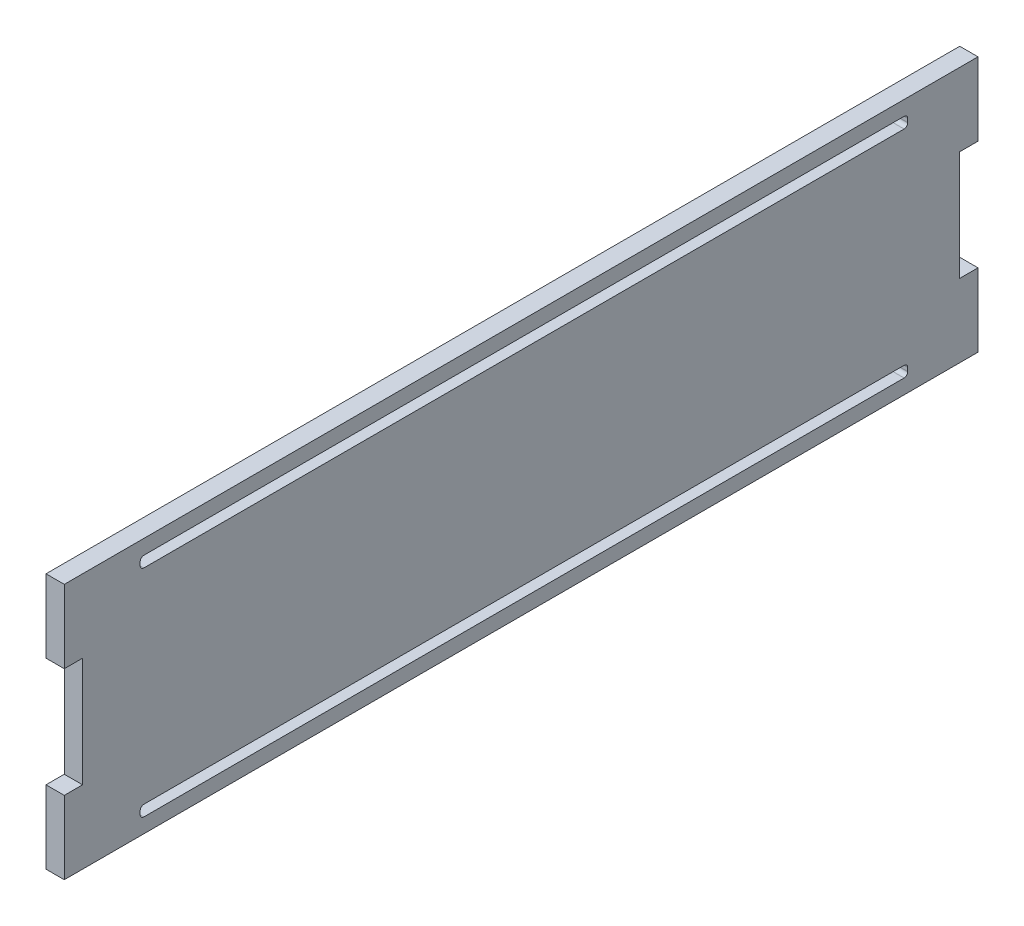
ISO-10303-21;
HEADER;
FILE_DESCRIPTION(('STEP AP214'),'2;1');
FILE_NAME('part.step','',(''),(''),'','','');
FILE_SCHEMA(('AUTOMOTIVE_DESIGN { 1 0 10303 214 1 1 1 1 }'));
ENDSEC;
DATA;
#1=APPLICATION_CONTEXT('core data for automotive mechanical design processes');
#2=APPLICATION_PROTOCOL_DEFINITION('international standard','automotive_design',2000,#1);
#3=PRODUCT_CONTEXT('',#1,'mechanical');
#4=PRODUCT('Part','Part','',(#3));
#5=PRODUCT_RELATED_PRODUCT_CATEGORY('part','',(#4));
#6=PRODUCT_DEFINITION_FORMATION('','',#4);
#7=PRODUCT_DEFINITION_CONTEXT('part definition',#1,'design');
#8=PRODUCT_DEFINITION('design','',#6,#7);
#9=PRODUCT_DEFINITION_SHAPE('','',#8);
#10=(LENGTH_UNIT() NAMED_UNIT(*) SI_UNIT(.MILLI.,.METRE.));
#11=(NAMED_UNIT(*) PLANE_ANGLE_UNIT() SI_UNIT($,.RADIAN.));
#12=(NAMED_UNIT(*) SI_UNIT($,.STERADIAN.) SOLID_ANGLE_UNIT());
#13=UNCERTAINTY_MEASURE_WITH_UNIT(LENGTH_MEASURE(1.E-05),#10,'distance_accuracy_value','');
#14=(GEOMETRIC_REPRESENTATION_CONTEXT(3) GLOBAL_UNCERTAINTY_ASSIGNED_CONTEXT((#13)) GLOBAL_UNIT_ASSIGNED_CONTEXT((#10,
#11,#12)) REPRESENTATION_CONTEXT('',''));
#15=CARTESIAN_POINT('',(0.,0.,0.));
#16=DIRECTION('',(0.,0.,1.));
#17=DIRECTION('',(1.,0.,0.));
#18=AXIS2_PLACEMENT_3D('',#15,#16,#17);
#19=CARTESIAN_POINT('',(5.,0.,0.));
#20=DIRECTION('',(1.,0.,0.));
#21=DIRECTION('',(0.,0.,-1.));
#22=AXIS2_PLACEMENT_3D('',#19,#20,#21);
#23=PLANE('',#22);
#24=DIRECTION('',(0.,1.,0.));
#25=VECTOR('',#24,1.);
#26=CARTESIAN_POINT('',(5.,0.,0.));
#27=LINE('',#26,#25);
#28=CARTESIAN_POINT('',(5.,0.,0.));
#29=VERTEX_POINT('',#28);
#30=CARTESIAN_POINT('',(5.,20.,0.));
#31=VERTEX_POINT('',#30);
#32=EDGE_CURVE('E344',#29,#31,#27,.T.);
#33=ORIENTED_EDGE('',*,*,#32,.T.);
#34=DIRECTION('',(0.,0.,1.));
#35=VECTOR('',#34,1.);
#36=CARTESIAN_POINT('',(5.,20.,0.));
#37=LINE('',#36,#35);
#38=CARTESIAN_POINT('',(5.,20.,5.));
#39=VERTEX_POINT('',#38);
#40=EDGE_CURVE('E347',#31,#39,#37,.T.);
#41=ORIENTED_EDGE('',*,*,#40,.T.);
#42=DIRECTION('',(0.,1.,0.));
#43=VECTOR('',#42,1.);
#44=CARTESIAN_POINT('',(5.,50.,5.00000000000001));
#45=LINE('',#44,#43);
#46=CARTESIAN_POINT('',(5.,50.,5.00000000000001));
#47=VERTEX_POINT('',#46);
#48=EDGE_CURVE('E350',#39,#47,#45,.T.);
#49=ORIENTED_EDGE('',*,*,#48,.T.);
#50=DIRECTION('',(0.,0.,-1.));
#51=VECTOR('',#50,1.);
#52=CARTESIAN_POINT('',(5.,50.,5.00000000000001));
#53=LINE('',#52,#51);
#54=CARTESIAN_POINT('',(5.,50.,0.));
#55=VERTEX_POINT('',#54);
#56=EDGE_CURVE('E352',#47,#55,#53,.T.);
#57=ORIENTED_EDGE('',*,*,#56,.T.);
#58=DIRECTION('',(0.,1.,0.));
#59=VECTOR('',#58,1.);
#60=CARTESIAN_POINT('',(5.,50.,0.));
#61=LINE('',#60,#59);
#62=CARTESIAN_POINT('',(5.,70.,0.));
#63=VERTEX_POINT('',#62);
#64=EDGE_CURVE('E354',#55,#63,#61,.T.);
#65=ORIENTED_EDGE('',*,*,#64,.T.);
#66=DIRECTION('',(0.,0.,1.));
#67=VECTOR('',#66,1.);
#68=CARTESIAN_POINT('',(5.,70.,0.));
#69=LINE('',#68,#67);
#70=CARTESIAN_POINT('',(5.,70.,250.));
#71=VERTEX_POINT('',#70);
#72=EDGE_CURVE('E356',#63,#71,#69,.T.);
#73=ORIENTED_EDGE('',*,*,#72,.T.);
#74=DIRECTION('',(0.,-1.,0.));
#75=VECTOR('',#74,1.);
#76=CARTESIAN_POINT('',(5.,50.,250.));
#77=LINE('',#76,#75);
#78=CARTESIAN_POINT('',(5.,50.,250.));
#79=VERTEX_POINT('',#78);
#80=EDGE_CURVE('E358',#71,#79,#77,.T.);
#81=ORIENTED_EDGE('',*,*,#80,.T.);
#82=DIRECTION('',(0.,0.,-1.));
#83=VECTOR('',#82,1.);
#84=CARTESIAN_POINT('',(5.,50.,245.));
#85=LINE('',#84,#83);
#86=CARTESIAN_POINT('',(5.,50.,245.));
#87=VERTEX_POINT('',#86);
#88=EDGE_CURVE('E360',#79,#87,#85,.T.);
#89=ORIENTED_EDGE('',*,*,#88,.T.);
#90=DIRECTION('',(0.,-1.,0.));
#91=VECTOR('',#90,1.);
#92=CARTESIAN_POINT('',(5.,50.,245.));
#93=LINE('',#92,#91);
#94=CARTESIAN_POINT('',(5.,20.,245.));
#95=VERTEX_POINT('',#94);
#96=EDGE_CURVE('E362',#87,#95,#93,.T.);
#97=ORIENTED_EDGE('',*,*,#96,.T.);
#98=DIRECTION('',(0.,0.,1.));
#99=VECTOR('',#98,1.);
#100=CARTESIAN_POINT('',(5.,20.,250.));
#101=LINE('',#100,#99);
#102=CARTESIAN_POINT('',(5.,20.,250.));
#103=VERTEX_POINT('',#102);
#104=EDGE_CURVE('E364',#95,#103,#101,.T.);
#105=ORIENTED_EDGE('',*,*,#104,.T.);
#106=DIRECTION('',(0.,-1.,0.));
#107=VECTOR('',#106,1.);
#108=CARTESIAN_POINT('',(5.,0.,250.));
#109=LINE('',#108,#107);
#110=CARTESIAN_POINT('',(5.,0.,250.));
#111=VERTEX_POINT('',#110);
#112=EDGE_CURVE('E366',#103,#111,#109,.T.);
#113=ORIENTED_EDGE('',*,*,#112,.T.);
#114=DIRECTION('',(0.,0.,-1.));
#115=VECTOR('',#114,1.);
#116=CARTESIAN_POINT('',(5.,0.,0.));
#117=LINE('',#116,#115);
#118=EDGE_CURVE('E368',#111,#29,#117,.T.);
#119=ORIENTED_EDGE('',*,*,#118,.T.);
#120=EDGE_LOOP('',(#33,#41,#49,#57,#65,#73,#81,#89,#97,#105,#113,#119));
#121=FACE_BOUND('',#120,.T.);
#122=DIRECTION('',(0.,1.,0.));
#123=VECTOR('',#122,1.);
#124=CARTESIAN_POINT('',(5.,65.,19.2219096004728));
#125=LINE('',#124,#123);
#126=CARTESIAN_POINT('',(5.,64.,19.2219096004728));
#127=VERTEX_POINT('',#126);
#128=CARTESIAN_POINT('',(5.,65.,19.2219096004728));
#129=VERTEX_POINT('',#128);
#130=EDGE_CURVE('E287',#127,#129,#125,.T.);
#131=ORIENTED_EDGE('',*,*,#130,.F.);
#132=CARTESIAN_POINT('',(5.,64.,20.2219096004728));
#133=DIRECTION('',(1.,0.,0.));
#134=DIRECTION('',(0.,0.,-1.));
#135=AXIS2_PLACEMENT_3D('',#132,#133,#134);
#136=CIRCLE('',#135,0.999999999999994);
#137=CARTESIAN_POINT('',(5.,63.,20.2219096004728));
#138=VERTEX_POINT('',#137);
#139=EDGE_CURVE('E285',#138,#127,#136,.T.);
#140=ORIENTED_EDGE('',*,*,#139,.F.);
#141=DIRECTION('',(0.,0.,-1.));
#142=VECTOR('',#141,1.);
#143=CARTESIAN_POINT('',(5.,63.,228.221909600473));
#144=LINE('',#143,#142);
#145=CARTESIAN_POINT('',(5.,63.,228.221909600473));
#146=VERTEX_POINT('',#145);
#147=EDGE_CURVE('E301',#146,#138,#144,.T.);
#148=ORIENTED_EDGE('',*,*,#147,.F.);
#149=CARTESIAN_POINT('',(5.,64.,228.221909600473));
#150=DIRECTION('',(1.,0.,0.));
#151=DIRECTION('',(0.,0.,-1.));
#152=AXIS2_PLACEMENT_3D('',#149,#150,#151);
#153=CIRCLE('',#152,1.00000000000001);
#154=CARTESIAN_POINT('',(5.,64.,229.221909600473));
#155=VERTEX_POINT('',#154);
#156=EDGE_CURVE('E298',#155,#146,#153,.T.);
#157=ORIENTED_EDGE('',*,*,#156,.F.);
#158=DIRECTION('',(0.,-1.,0.));
#159=VECTOR('',#158,1.);
#160=CARTESIAN_POINT('',(5.,65.,229.221909600473));
#161=LINE('',#160,#159);
#162=CARTESIAN_POINT('',(5.,65.,229.221909600473));
#163=VERTEX_POINT('',#162);
#164=EDGE_CURVE('E296',#163,#155,#161,.T.);
#165=ORIENTED_EDGE('',*,*,#164,.F.);
#166=CARTESIAN_POINT('',(5.,65.,228.221909600473));
#167=DIRECTION('',(1.,0.,0.));
#168=DIRECTION('',(0.,0.,-1.));
#169=AXIS2_PLACEMENT_3D('',#166,#167,#168);
#170=CIRCLE('',#169,1.00000000000001);
#171=CARTESIAN_POINT('',(5.,66.,228.221909600473));
#172=VERTEX_POINT('',#171);
#173=EDGE_CURVE('E294',#172,#163,#170,.T.);
#174=ORIENTED_EDGE('',*,*,#173,.F.);
#175=DIRECTION('',(0.,0.,1.));
#176=VECTOR('',#175,1.);
#177=CARTESIAN_POINT('',(5.,66.,228.221909600473));
#178=LINE('',#177,#176);
#179=CARTESIAN_POINT('',(5.,66.,20.2219096004728));
#180=VERTEX_POINT('',#179);
#181=EDGE_CURVE('E292',#180,#172,#178,.T.);
#182=ORIENTED_EDGE('',*,*,#181,.F.);
#183=CARTESIAN_POINT('',(5.,65.,20.2219096004728));
#184=DIRECTION('',(1.,0.,0.));
#185=DIRECTION('',(0.,0.,1.));
#186=AXIS2_PLACEMENT_3D('',#183,#184,#185);
#187=CIRCLE('',#186,0.999999999999994);
#188=EDGE_CURVE('E290',#129,#180,#187,.T.);
#189=ORIENTED_EDGE('',*,*,#188,.F.);
#190=EDGE_LOOP('',(#131,#140,#148,#157,#165,#174,#182,#189));
#191=FACE_BOUND('',#190,.T.);
#192=DIRECTION('',(0.,1.,0.));
#193=VECTOR('',#192,1.);
#194=CARTESIAN_POINT('',(5.,4.99999999999998,19.2219096004727));
#195=LINE('',#194,#193);
#196=CARTESIAN_POINT('',(5.,4.99999999999998,19.2219096004727));
#197=VERTEX_POINT('',#196);
#198=CARTESIAN_POINT('',(5.,5.99999999999998,19.2219096004727));
#199=VERTEX_POINT('',#198);
#200=EDGE_CURVE('E228',#197,#199,#195,.T.);
#201=ORIENTED_EDGE('',*,*,#200,.F.);
#202=CARTESIAN_POINT('',(5.,4.99999999999998,20.2219096004727));
#203=DIRECTION('',(1.,0.,0.));
#204=DIRECTION('',(0.,0.,-1.));
#205=AXIS2_PLACEMENT_3D('',#202,#203,#204);
#206=CIRCLE('',#205,0.999999999999994);
#207=CARTESIAN_POINT('',(5.,3.99999999999998,20.2219096004727));
#208=VERTEX_POINT('',#207);
#209=EDGE_CURVE('E220',#208,#197,#206,.T.);
#210=ORIENTED_EDGE('',*,*,#209,.F.);
#211=DIRECTION('',(0.,0.,-1.));
#212=VECTOR('',#211,1.);
#213=CARTESIAN_POINT('',(5.,3.99999999999998,228.221909600473));
#214=LINE('',#213,#212);
#215=CARTESIAN_POINT('',(5.,3.99999999999998,228.221909600473));
#216=VERTEX_POINT('',#215);
#217=EDGE_CURVE('E253',#216,#208,#214,.T.);
#218=ORIENTED_EDGE('',*,*,#217,.F.);
#219=CARTESIAN_POINT('',(5.,4.99999999999998,228.221909600473));
#220=DIRECTION('',(1.,0.,0.));
#221=DIRECTION('',(0.,0.,1.));
#222=AXIS2_PLACEMENT_3D('',#219,#220,#221);
#223=CIRCLE('',#222,1.);
#224=CARTESIAN_POINT('',(5.,4.99999999999998,229.221909600473));
#225=VERTEX_POINT('',#224);
#226=EDGE_CURVE('E251',#225,#216,#223,.T.);
#227=ORIENTED_EDGE('',*,*,#226,.F.);
#228=DIRECTION('',(0.,-1.,0.));
#229=VECTOR('',#228,1.);
#230=CARTESIAN_POINT('',(5.,4.99999999999998,229.221909600473));
#231=LINE('',#230,#229);
#232=CARTESIAN_POINT('',(5.,5.99999999999998,229.221909600473));
#233=VERTEX_POINT('',#232);
#234=EDGE_CURVE('E249',#233,#225,#231,.T.);
#235=ORIENTED_EDGE('',*,*,#234,.F.);
#236=CARTESIAN_POINT('',(5.,5.99999999999998,228.221909600473));
#237=DIRECTION('',(1.,0.,0.));
#238=DIRECTION('',(0.,0.,1.));
#239=AXIS2_PLACEMENT_3D('',#236,#237,#238);
#240=CIRCLE('',#239,1.);
#241=CARTESIAN_POINT('',(5.,6.99999999999998,228.221909600473));
#242=VERTEX_POINT('',#241);
#243=EDGE_CURVE('E247',#242,#233,#240,.T.);
#244=ORIENTED_EDGE('',*,*,#243,.F.);
#245=DIRECTION('',(0.,0.,1.));
#246=VECTOR('',#245,1.);
#247=CARTESIAN_POINT('',(5.,6.99999999999998,228.221909600473));
#248=LINE('',#247,#246);
#249=CARTESIAN_POINT('',(5.,6.99999999999998,20.2219096004727));
#250=VERTEX_POINT('',#249);
#251=EDGE_CURVE('E243',#250,#242,#248,.T.);
#252=ORIENTED_EDGE('',*,*,#251,.F.);
#253=CARTESIAN_POINT('',(5.,5.99999999999998,20.2219096004727));
#254=DIRECTION('',(1.,0.,0.));
#255=DIRECTION('',(0.,0.,1.));
#256=AXIS2_PLACEMENT_3D('',#253,#254,#255);
#257=CIRCLE('',#256,0.999999999999994);
#258=EDGE_CURVE('E241',#199,#250,#257,.T.);
#259=ORIENTED_EDGE('',*,*,#258,.F.);
#260=EDGE_LOOP('',(#201,#210,#218,#227,#235,#244,#252,#259));
#261=FACE_BOUND('',#260,.T.);
#262=ADVANCED_FACE('F35',(#121,#191,#261),#23,.T.);
#263=CARTESIAN_POINT('',(0.,0.,0.));
#264=DIRECTION('',(1.,0.,0.));
#265=DIRECTION('',(0.,0.,-1.));
#266=AXIS2_PLACEMENT_3D('',#263,#264,#265);
#267=PLANE('',#266);
#268=CARTESIAN_POINT('',(0.,64.,20.2219096004728));
#269=DIRECTION('',(1.,0.,0.));
#270=DIRECTION('',(0.,0.,-1.));
#271=AXIS2_PLACEMENT_3D('',#268,#269,#270);
#272=CIRCLE('',#271,0.999999999999994);
#273=CARTESIAN_POINT('',(0.,63.,20.2219096004728));
#274=VERTEX_POINT('',#273);
#275=CARTESIAN_POINT('',(0.,64.,19.2219096004728));
#276=VERTEX_POINT('',#275);
#277=EDGE_CURVE('E236',#274,#276,#272,.T.);
#278=ORIENTED_EDGE('',*,*,#277,.T.);
#279=DIRECTION('',(0.,1.,0.));
#280=VECTOR('',#279,1.);
#281=CARTESIAN_POINT('',(0.,65.,19.2219096004728));
#282=LINE('',#281,#280);
#283=CARTESIAN_POINT('',(0.,65.,19.2219096004728));
#284=VERTEX_POINT('',#283);
#285=EDGE_CURVE('E306',#276,#284,#282,.T.);
#286=ORIENTED_EDGE('',*,*,#285,.T.);
#287=CARTESIAN_POINT('',(0.,65.,20.2219096004728));
#288=DIRECTION('',(1.,0.,0.));
#289=DIRECTION('',(0.,0.,1.));
#290=AXIS2_PLACEMENT_3D('',#287,#288,#289);
#291=CIRCLE('',#290,0.999999999999994);
#292=CARTESIAN_POINT('',(0.,66.,20.2219096004728));
#293=VERTEX_POINT('',#292);
#294=EDGE_CURVE('E309',#284,#293,#291,.T.);
#295=ORIENTED_EDGE('',*,*,#294,.T.);
#296=DIRECTION('',(0.,0.,1.));
#297=VECTOR('',#296,1.);
#298=CARTESIAN_POINT('',(0.,66.,228.221909600473));
#299=LINE('',#298,#297);
#300=CARTESIAN_POINT('',(0.,66.,228.221909600473));
#301=VERTEX_POINT('',#300);
#302=EDGE_CURVE('E312',#293,#301,#299,.T.);
#303=ORIENTED_EDGE('',*,*,#302,.T.);
#304=CARTESIAN_POINT('',(0.,65.,228.221909600473));
#305=DIRECTION('',(1.,0.,0.));
#306=DIRECTION('',(0.,0.,-1.));
#307=AXIS2_PLACEMENT_3D('',#304,#305,#306);
#308=CIRCLE('',#307,1.00000000000001);
#309=CARTESIAN_POINT('',(0.,65.,229.221909600473));
#310=VERTEX_POINT('',#309);
#311=EDGE_CURVE('E315',#301,#310,#308,.T.);
#312=ORIENTED_EDGE('',*,*,#311,.T.);
#313=DIRECTION('',(0.,-1.,0.));
#314=VECTOR('',#313,1.);
#315=CARTESIAN_POINT('',(0.,65.,229.221909600473));
#316=LINE('',#315,#314);
#317=CARTESIAN_POINT('',(0.,64.,229.221909600473));
#318=VERTEX_POINT('',#317);
#319=EDGE_CURVE('E318',#310,#318,#316,.T.);
#320=ORIENTED_EDGE('',*,*,#319,.T.);
#321=CARTESIAN_POINT('',(0.,64.,228.221909600473));
#322=DIRECTION('',(1.,0.,0.));
#323=DIRECTION('',(0.,0.,-1.));
#324=AXIS2_PLACEMENT_3D('',#321,#322,#323);
#325=CIRCLE('',#324,1.00000000000001);
#326=CARTESIAN_POINT('',(0.,63.,228.221909600473));
#327=VERTEX_POINT('',#326);
#328=EDGE_CURVE('E321',#318,#327,#325,.T.);
#329=ORIENTED_EDGE('',*,*,#328,.T.);
#330=DIRECTION('',(0.,0.,-1.));
#331=VECTOR('',#330,1.);
#332=CARTESIAN_POINT('',(0.,63.,228.221909600473));
#333=LINE('',#332,#331);
#334=EDGE_CURVE('E288',#327,#274,#333,.T.);
#335=ORIENTED_EDGE('',*,*,#334,.T.);
#336=EDGE_LOOP('',(#278,#286,#295,#303,#312,#320,#329,#335));
#337=FACE_BOUND('',#336,.T.);
#338=DIRECTION('',(0.,1.,0.));
#339=VECTOR('',#338,1.);
#340=CARTESIAN_POINT('',(0.,0.,0.));
#341=LINE('',#340,#339);
#342=CARTESIAN_POINT('',(0.,0.,0.));
#343=VERTEX_POINT('',#342);
#344=CARTESIAN_POINT('',(0.,20.,0.));
#345=VERTEX_POINT('',#344);
#346=EDGE_CURVE('E343',#343,#345,#341,.T.);
#347=ORIENTED_EDGE('',*,*,#346,.F.);
#348=DIRECTION('',(0.,0.,-1.));
#349=VECTOR('',#348,1.);
#350=CARTESIAN_POINT('',(0.,0.,0.));
#351=LINE('',#350,#349);
#352=CARTESIAN_POINT('',(0.,0.,250.));
#353=VERTEX_POINT('',#352);
#354=EDGE_CURVE('E348',#353,#343,#351,.T.);
#355=ORIENTED_EDGE('',*,*,#354,.F.);
#356=DIRECTION('',(0.,-1.,0.));
#357=VECTOR('',#356,1.);
#358=CARTESIAN_POINT('',(0.,0.,250.));
#359=LINE('',#358,#357);
#360=CARTESIAN_POINT('',(0.,20.,250.));
#361=VERTEX_POINT('',#360);
#362=EDGE_CURVE('E391',#361,#353,#359,.T.);
#363=ORIENTED_EDGE('',*,*,#362,.F.);
#364=DIRECTION('',(0.,0.,1.));
#365=VECTOR('',#364,1.);
#366=CARTESIAN_POINT('',(0.,20.,250.));
#367=LINE('',#366,#365);
#368=CARTESIAN_POINT('',(0.,20.,245.));
#369=VERTEX_POINT('',#368);
#370=EDGE_CURVE('E389',#369,#361,#367,.T.);
#371=ORIENTED_EDGE('',*,*,#370,.F.);
#372=DIRECTION('',(0.,-1.,0.));
#373=VECTOR('',#372,1.);
#374=CARTESIAN_POINT('',(0.,50.,245.));
#375=LINE('',#374,#373);
#376=CARTESIAN_POINT('',(0.,50.,245.));
#377=VERTEX_POINT('',#376);
#378=EDGE_CURVE('E387',#377,#369,#375,.T.);
#379=ORIENTED_EDGE('',*,*,#378,.F.);
#380=DIRECTION('',(0.,0.,-1.));
#381=VECTOR('',#380,1.);
#382=CARTESIAN_POINT('',(0.,50.,245.));
#383=LINE('',#382,#381);
#384=CARTESIAN_POINT('',(0.,50.,250.));
#385=VERTEX_POINT('',#384);
#386=EDGE_CURVE('E385',#385,#377,#383,.T.);
#387=ORIENTED_EDGE('',*,*,#386,.F.);
#388=DIRECTION('',(0.,-1.,0.));
#389=VECTOR('',#388,1.);
#390=CARTESIAN_POINT('',(0.,50.,250.));
#391=LINE('',#390,#389);
#392=CARTESIAN_POINT('',(0.,70.,250.));
#393=VERTEX_POINT('',#392);
#394=EDGE_CURVE('E383',#393,#385,#391,.T.);
#395=ORIENTED_EDGE('',*,*,#394,.F.);
#396=DIRECTION('',(0.,0.,1.));
#397=VECTOR('',#396,1.);
#398=CARTESIAN_POINT('',(0.,70.,0.));
#399=LINE('',#398,#397);
#400=CARTESIAN_POINT('',(0.,70.,0.));
#401=VERTEX_POINT('',#400);
#402=EDGE_CURVE('E381',#401,#393,#399,.T.);
#403=ORIENTED_EDGE('',*,*,#402,.F.);
#404=DIRECTION('',(0.,1.,0.));
#405=VECTOR('',#404,1.);
#406=CARTESIAN_POINT('',(0.,50.,0.));
#407=LINE('',#406,#405);
#408=CARTESIAN_POINT('',(0.,50.,0.));
#409=VERTEX_POINT('',#408);
#410=EDGE_CURVE('E379',#409,#401,#407,.T.);
#411=ORIENTED_EDGE('',*,*,#410,.F.);
#412=DIRECTION('',(0.,0.,-1.));
#413=VECTOR('',#412,1.);
#414=CARTESIAN_POINT('',(0.,50.,5.00000000000001));
#415=LINE('',#414,#413);
#416=CARTESIAN_POINT('',(0.,50.,5.00000000000001));
#417=VERTEX_POINT('',#416);
#418=EDGE_CURVE('E377',#417,#409,#415,.T.);
#419=ORIENTED_EDGE('',*,*,#418,.F.);
#420=DIRECTION('',(0.,1.,0.));
#421=VECTOR('',#420,1.);
#422=CARTESIAN_POINT('',(0.,50.,5.00000000000001));
#423=LINE('',#422,#421);
#424=CARTESIAN_POINT('',(0.,20.,5.));
#425=VERTEX_POINT('',#424);
#426=EDGE_CURVE('E375',#425,#417,#423,.T.);
#427=ORIENTED_EDGE('',*,*,#426,.F.);
#428=DIRECTION('',(0.,0.,1.));
#429=VECTOR('',#428,1.);
#430=CARTESIAN_POINT('',(0.,20.,0.));
#431=LINE('',#430,#429);
#432=EDGE_CURVE('E373',#345,#425,#431,.T.);
#433=ORIENTED_EDGE('',*,*,#432,.F.);
#434=EDGE_LOOP('',(#347,#355,#363,#371,#379,#387,#395,#403,#411,#419,#427,#433));
#435=FACE_BOUND('',#434,.T.);
#436=CARTESIAN_POINT('',(0.,4.99999999999998,20.2219096004727));
#437=DIRECTION('',(1.,0.,0.));
#438=DIRECTION('',(0.,0.,-1.));
#439=AXIS2_PLACEMENT_3D('',#436,#437,#438);
#440=CIRCLE('',#439,0.999999999999994);
#441=CARTESIAN_POINT('',(0.,3.99999999999998,20.2219096004727));
#442=VERTEX_POINT('',#441);
#443=CARTESIAN_POINT('',(0.,4.99999999999998,19.2219096004727));
#444=VERTEX_POINT('',#443);
#445=EDGE_CURVE('E58',#442,#444,#440,.T.);
#446=ORIENTED_EDGE('',*,*,#445,.T.);
#447=DIRECTION('',(0.,1.,0.));
#448=VECTOR('',#447,1.);
#449=CARTESIAN_POINT('',(0.,4.99999999999998,19.2219096004727));
#450=LINE('',#449,#448);
#451=CARTESIAN_POINT('',(0.,5.99999999999998,19.2219096004727));
#452=VERTEX_POINT('',#451);
#453=EDGE_CURVE('E235',#444,#452,#450,.T.);
#454=ORIENTED_EDGE('',*,*,#453,.T.);
#455=CARTESIAN_POINT('',(0.,5.99999999999998,20.2219096004727));
#456=DIRECTION('',(1.,0.,0.));
#457=DIRECTION('',(0.,0.,1.));
#458=AXIS2_PLACEMENT_3D('',#455,#456,#457);
#459=CIRCLE('',#458,0.999999999999994);
#460=CARTESIAN_POINT('',(0.,6.99999999999998,20.2219096004727));
#461=VERTEX_POINT('',#460);
#462=EDGE_CURVE('E257',#452,#461,#459,.T.);
#463=ORIENTED_EDGE('',*,*,#462,.T.);
#464=DIRECTION('',(0.,0.,1.));
#465=VECTOR('',#464,1.);
#466=CARTESIAN_POINT('',(0.,6.99999999999998,228.221909600473));
#467=LINE('',#466,#465);
#468=CARTESIAN_POINT('',(0.,6.99999999999998,228.221909600473));
#469=VERTEX_POINT('',#468);
#470=EDGE_CURVE('E260',#461,#469,#467,.T.);
#471=ORIENTED_EDGE('',*,*,#470,.T.);
#472=CARTESIAN_POINT('',(0.,5.99999999999998,228.221909600473));
#473=DIRECTION('',(1.,0.,0.));
#474=DIRECTION('',(0.,0.,1.));
#475=AXIS2_PLACEMENT_3D('',#472,#473,#474);
#476=CIRCLE('',#475,1.);
#477=CARTESIAN_POINT('',(0.,5.99999999999998,229.221909600473));
#478=VERTEX_POINT('',#477);
#479=EDGE_CURVE('E263',#469,#478,#476,.T.);
#480=ORIENTED_EDGE('',*,*,#479,.T.);
#481=DIRECTION('',(0.,-1.,0.));
#482=VECTOR('',#481,1.);
#483=CARTESIAN_POINT('',(0.,4.99999999999998,229.221909600473));
#484=LINE('',#483,#482);
#485=CARTESIAN_POINT('',(0.,4.99999999999998,229.221909600473));
#486=VERTEX_POINT('',#485);
#487=EDGE_CURVE('E266',#478,#486,#484,.T.);
#488=ORIENTED_EDGE('',*,*,#487,.T.);
#489=CARTESIAN_POINT('',(0.,4.99999999999998,228.221909600473));
#490=DIRECTION('',(1.,0.,0.));
#491=DIRECTION('',(0.,0.,1.));
#492=AXIS2_PLACEMENT_3D('',#489,#490,#491);
#493=CIRCLE('',#492,1.);
#494=CARTESIAN_POINT('',(0.,3.99999999999998,228.221909600473));
#495=VERTEX_POINT('',#494);
#496=EDGE_CURVE('E269',#486,#495,#493,.T.);
#497=ORIENTED_EDGE('',*,*,#496,.T.);
#498=DIRECTION('',(0.,0.,-1.));
#499=VECTOR('',#498,1.);
#500=CARTESIAN_POINT('',(0.,3.99999999999998,228.221909600473));
#501=LINE('',#500,#499);
#502=EDGE_CURVE('E229',#495,#442,#501,.T.);
#503=ORIENTED_EDGE('',*,*,#502,.T.);
#504=EDGE_LOOP('',(#446,#454,#463,#471,#480,#488,#497,#503));
#505=FACE_BOUND('',#504,.T.);
#506=ADVANCED_FACE('F433',(#337,#435,#505),#267,.F.);
#507=CARTESIAN_POINT('',(5.,0.,0.));
#508=DIRECTION('',(0.,0.,1.));
#509=DIRECTION('',(1.,0.,0.));
#510=AXIS2_PLACEMENT_3D('',#507,#508,#509);
#511=PLANE('',#510);
#512=ORIENTED_EDGE('',*,*,#346,.T.);
#513=DIRECTION('',(-1.,0.,0.));
#514=VECTOR('',#513,1.);
#515=CARTESIAN_POINT('',(5.,20.,0.));
#516=LINE('',#515,#514);
#517=EDGE_CURVE('E11',#31,#345,#516,.T.);
#518=ORIENTED_EDGE('',*,*,#517,.F.);
#519=ORIENTED_EDGE('',*,*,#32,.F.);
#520=DIRECTION('',(-1.,0.,0.));
#521=VECTOR('',#520,1.);
#522=CARTESIAN_POINT('',(5.,0.,0.));
#523=LINE('',#522,#521);
#524=EDGE_CURVE('E370',#29,#343,#523,.T.);
#525=ORIENTED_EDGE('',*,*,#524,.T.);
#526=EDGE_LOOP('',(#512,#518,#519,#525));
#527=FACE_BOUND('',#526,.T.);
#528=ADVANCED_FACE('F37',(#527),#511,.F.);
#529=CARTESIAN_POINT('',(5.,20.,0.));
#530=DIRECTION('',(0.,-1.,0.));
#531=DIRECTION('',(0.,0.,-1.));
#532=AXIS2_PLACEMENT_3D('',#529,#530,#531);
#533=PLANE('',#532);
#534=ORIENTED_EDGE('',*,*,#432,.T.);
#535=DIRECTION('',(-1.,0.,0.));
#536=VECTOR('',#535,1.);
#537=CARTESIAN_POINT('',(5.,20.,5.));
#538=LINE('',#537,#536);
#539=EDGE_CURVE('E43',#39,#425,#538,.T.);
#540=ORIENTED_EDGE('',*,*,#539,.F.);
#541=ORIENTED_EDGE('',*,*,#40,.F.);
#542=ORIENTED_EDGE('',*,*,#517,.T.);
#543=EDGE_LOOP('',(#534,#540,#541,#542));
#544=FACE_BOUND('',#543,.T.);
#545=ADVANCED_FACE('F451',(#544),#533,.F.);
#546=CARTESIAN_POINT('',(5.,50.,5.00000000000001));
#547=DIRECTION('',(0.,0.,1.));
#548=DIRECTION('',(0.,-1.,0.));
#549=AXIS2_PLACEMENT_3D('',#546,#547,#548);
#550=PLANE('',#549);
#551=ORIENTED_EDGE('',*,*,#426,.T.);
#552=DIRECTION('',(-1.,0.,0.));
#553=VECTOR('',#552,1.);
#554=CARTESIAN_POINT('',(5.,50.,5.00000000000001));
#555=LINE('',#554,#553);
#556=EDGE_CURVE('E420',#47,#417,#555,.T.);
#557=ORIENTED_EDGE('',*,*,#556,.F.);
#558=ORIENTED_EDGE('',*,*,#48,.F.);
#559=ORIENTED_EDGE('',*,*,#539,.T.);
#560=EDGE_LOOP('',(#551,#557,#558,#559));
#561=FACE_BOUND('',#560,.T.);
#562=ADVANCED_FACE('F427',(#561),#550,.F.);
#563=CARTESIAN_POINT('',(5.,50.,5.00000000000001));
#564=DIRECTION('',(0.,1.,0.));
#565=DIRECTION('',(0.,0.,1.));
#566=AXIS2_PLACEMENT_3D('',#563,#564,#565);
#567=PLANE('',#566);
#568=ORIENTED_EDGE('',*,*,#418,.T.);
#569=DIRECTION('',(-1.,0.,0.));
#570=VECTOR('',#569,1.);
#571=CARTESIAN_POINT('',(5.,50.,0.));
#572=LINE('',#571,#570);
#573=EDGE_CURVE('E417',#55,#409,#572,.T.);
#574=ORIENTED_EDGE('',*,*,#573,.F.);
#575=ORIENTED_EDGE('',*,*,#56,.F.);
#576=ORIENTED_EDGE('',*,*,#556,.T.);
#577=EDGE_LOOP('',(#568,#574,#575,#576));
#578=FACE_BOUND('',#577,.T.);
#579=ADVANCED_FACE('F439',(#578),#567,.F.);
#580=CARTESIAN_POINT('',(5.,50.,0.));
#581=DIRECTION('',(0.,0.,1.));
#582=DIRECTION('',(1.,0.,0.));
#583=AXIS2_PLACEMENT_3D('',#580,#581,#582);
#584=PLANE('',#583);
#585=ORIENTED_EDGE('',*,*,#410,.T.);
#586=DIRECTION('',(-1.,0.,0.));
#587=VECTOR('',#586,1.);
#588=CARTESIAN_POINT('',(5.,70.,0.));
#589=LINE('',#588,#587);
#590=EDGE_CURVE('E414',#63,#401,#589,.T.);
#591=ORIENTED_EDGE('',*,*,#590,.F.);
#592=ORIENTED_EDGE('',*,*,#64,.F.);
#593=ORIENTED_EDGE('',*,*,#573,.T.);
#594=EDGE_LOOP('',(#585,#591,#592,#593));
#595=FACE_BOUND('',#594,.T.);
#596=ADVANCED_FACE('F443',(#595),#584,.F.);
#597=CARTESIAN_POINT('',(5.,70.,0.));
#598=DIRECTION('',(0.,-1.,0.));
#599=DIRECTION('',(0.,0.,-1.));
#600=AXIS2_PLACEMENT_3D('',#597,#598,#599);
#601=PLANE('',#600);
#602=ORIENTED_EDGE('',*,*,#402,.T.);
#603=DIRECTION('',(-1.,0.,0.));
#604=VECTOR('',#603,1.);
#605=CARTESIAN_POINT('',(5.,70.,250.));
#606=LINE('',#605,#604);
#607=EDGE_CURVE('E411',#71,#393,#606,.T.);
#608=ORIENTED_EDGE('',*,*,#607,.F.);
#609=ORIENTED_EDGE('',*,*,#72,.F.);
#610=ORIENTED_EDGE('',*,*,#590,.T.);
#611=EDGE_LOOP('',(#602,#608,#609,#610));
#612=FACE_BOUND('',#611,.T.);
#613=ADVANCED_FACE('F484',(#612),#601,.F.);
#614=CARTESIAN_POINT('',(5.,50.,250.));
#615=DIRECTION('',(0.,0.,-1.));
#616=DIRECTION('',(-1.,0.,0.));
#617=AXIS2_PLACEMENT_3D('',#614,#615,#616);
#618=PLANE('',#617);
#619=ORIENTED_EDGE('',*,*,#394,.T.);
#620=DIRECTION('',(-1.,0.,0.));
#621=VECTOR('',#620,1.);
#622=CARTESIAN_POINT('',(5.,50.,250.));
#623=LINE('',#622,#621);
#624=EDGE_CURVE('E408',#79,#385,#623,.T.);
#625=ORIENTED_EDGE('',*,*,#624,.F.);
#626=ORIENTED_EDGE('',*,*,#80,.F.);
#627=ORIENTED_EDGE('',*,*,#607,.T.);
#628=EDGE_LOOP('',(#619,#625,#626,#627));
#629=FACE_BOUND('',#628,.T.);
#630=ADVANCED_FACE('F482',(#629),#618,.F.);
#631=CARTESIAN_POINT('',(5.,50.,245.));
#632=DIRECTION('',(0.,1.,0.));
#633=DIRECTION('',(0.,0.,1.));
#634=AXIS2_PLACEMENT_3D('',#631,#632,#633);
#635=PLANE('',#634);
#636=ORIENTED_EDGE('',*,*,#386,.T.);
#637=DIRECTION('',(-1.,0.,0.));
#638=VECTOR('',#637,1.);
#639=CARTESIAN_POINT('',(5.,50.,245.));
#640=LINE('',#639,#638);
#641=EDGE_CURVE('E405',#87,#377,#640,.T.);
#642=ORIENTED_EDGE('',*,*,#641,.F.);
#643=ORIENTED_EDGE('',*,*,#88,.F.);
#644=ORIENTED_EDGE('',*,*,#624,.T.);
#645=EDGE_LOOP('',(#636,#642,#643,#644));
#646=FACE_BOUND('',#645,.T.);
#647=ADVANCED_FACE('F478',(#646),#635,.F.);
#648=CARTESIAN_POINT('',(5.,50.,245.));
#649=DIRECTION('',(0.,0.,-1.));
#650=DIRECTION('',(-1.,0.,0.));
#651=AXIS2_PLACEMENT_3D('',#648,#649,#650);
#652=PLANE('',#651);
#653=ORIENTED_EDGE('',*,*,#378,.T.);
#654=DIRECTION('',(-1.,0.,0.));
#655=VECTOR('',#654,1.);
#656=CARTESIAN_POINT('',(5.,20.,245.));
#657=LINE('',#656,#655);
#658=EDGE_CURVE('E402',#95,#369,#657,.T.);
#659=ORIENTED_EDGE('',*,*,#658,.F.);
#660=ORIENTED_EDGE('',*,*,#96,.F.);
#661=ORIENTED_EDGE('',*,*,#641,.T.);
#662=EDGE_LOOP('',(#653,#659,#660,#661));
#663=FACE_BOUND('',#662,.T.);
#664=ADVANCED_FACE('F473',(#663),#652,.F.);
#665=CARTESIAN_POINT('',(5.,20.,250.));
#666=DIRECTION('',(0.,-1.,0.));
#667=DIRECTION('',(0.,0.,-1.));
#668=AXIS2_PLACEMENT_3D('',#665,#666,#667);
#669=PLANE('',#668);
#670=ORIENTED_EDGE('',*,*,#370,.T.);
#671=DIRECTION('',(-1.,0.,0.));
#672=VECTOR('',#671,1.);
#673=CARTESIAN_POINT('',(5.,20.,250.));
#674=LINE('',#673,#672);
#675=EDGE_CURVE('E399',#103,#361,#674,.T.);
#676=ORIENTED_EDGE('',*,*,#675,.F.);
#677=ORIENTED_EDGE('',*,*,#104,.F.);
#678=ORIENTED_EDGE('',*,*,#658,.T.);
#679=EDGE_LOOP('',(#670,#676,#677,#678));
#680=FACE_BOUND('',#679,.T.);
#681=ADVANCED_FACE('F467',(#680),#669,.F.);
#682=CARTESIAN_POINT('',(5.,0.,250.));
#683=DIRECTION('',(0.,0.,-1.));
#684=DIRECTION('',(-1.,0.,0.));
#685=AXIS2_PLACEMENT_3D('',#682,#683,#684);
#686=PLANE('',#685);
#687=ORIENTED_EDGE('',*,*,#362,.T.);
#688=DIRECTION('',(-1.,0.,0.));
#689=VECTOR('',#688,1.);
#690=CARTESIAN_POINT('',(5.,0.,250.));
#691=LINE('',#690,#689);
#692=EDGE_CURVE('E396',#111,#353,#691,.T.);
#693=ORIENTED_EDGE('',*,*,#692,.F.);
#694=ORIENTED_EDGE('',*,*,#112,.F.);
#695=ORIENTED_EDGE('',*,*,#675,.T.);
#696=EDGE_LOOP('',(#687,#693,#694,#695));
#697=FACE_BOUND('',#696,.T.);
#698=ADVANCED_FACE('F463',(#697),#686,.F.);
#699=CARTESIAN_POINT('',(5.,0.,0.));
#700=DIRECTION('',(0.,1.,0.));
#701=DIRECTION('',(0.,0.,1.));
#702=AXIS2_PLACEMENT_3D('',#699,#700,#701);
#703=PLANE('',#702);
#704=ORIENTED_EDGE('',*,*,#354,.T.);
#705=ORIENTED_EDGE('',*,*,#524,.F.);
#706=ORIENTED_EDGE('',*,*,#118,.F.);
#707=ORIENTED_EDGE('',*,*,#692,.T.);
#708=EDGE_LOOP('',(#704,#705,#706,#707));
#709=FACE_BOUND('',#708,.T.);
#710=ADVANCED_FACE('F458',(#709),#703,.F.);
#711=CARTESIAN_POINT('',(5.,64.,20.2219096004728));
#712=DIRECTION('',(-1.,0.,0.));
#713=DIRECTION('',(0.,0.,1.));
#714=AXIS2_PLACEMENT_3D('',#711,#712,#713);
#715=CYLINDRICAL_SURFACE('',#714,0.999999999999994);
#716=ORIENTED_EDGE('',*,*,#277,.F.);
#717=DIRECTION('',(-1.,0.,0.));
#718=VECTOR('',#717,1.);
#719=CARTESIAN_POINT('',(5.,63.,20.2219096004728));
#720=LINE('',#719,#718);
#721=EDGE_CURVE('E303',#138,#274,#720,.T.);
#722=ORIENTED_EDGE('',*,*,#721,.F.);
#723=ORIENTED_EDGE('',*,*,#139,.T.);
#724=DIRECTION('',(-1.,0.,0.));
#725=VECTOR('',#724,1.);
#726=CARTESIAN_POINT('',(5.,64.,19.2219096004728));
#727=LINE('',#726,#725);
#728=EDGE_CURVE('E340',#127,#276,#727,.T.);
#729=ORIENTED_EDGE('',*,*,#728,.T.);
#730=EDGE_LOOP('',(#716,#722,#723,#729));
#731=FACE_BOUND('',#730,.T.);
#732=ADVANCED_FACE('F501',(#731),#715,.F.);
#733=CARTESIAN_POINT('',(5.,65.,19.2219096004728));
#734=DIRECTION('',(0.,0.,1.));
#735=DIRECTION('',(1.,0.,0.));
#736=AXIS2_PLACEMENT_3D('',#733,#734,#735);
#737=PLANE('',#736);
#738=ORIENTED_EDGE('',*,*,#285,.F.);
#739=ORIENTED_EDGE('',*,*,#728,.F.);
#740=ORIENTED_EDGE('',*,*,#130,.T.);
#741=DIRECTION('',(-1.,0.,0.));
#742=VECTOR('',#741,1.);
#743=CARTESIAN_POINT('',(5.,65.,19.2219096004728));
#744=LINE('',#743,#742);
#745=EDGE_CURVE('E338',#129,#284,#744,.T.);
#746=ORIENTED_EDGE('',*,*,#745,.T.);
#747=EDGE_LOOP('',(#738,#739,#740,#746));
#748=FACE_BOUND('',#747,.T.);
#749=ADVANCED_FACE('F539',(#748),#737,.T.);
#750=CARTESIAN_POINT('',(5.,65.,20.2219096004728));
#751=DIRECTION('',(-1.,0.,0.));
#752=DIRECTION('',(0.,0.,1.));
#753=AXIS2_PLACEMENT_3D('',#750,#751,#752);
#754=CYLINDRICAL_SURFACE('',#753,0.999999999999994);
#755=ORIENTED_EDGE('',*,*,#294,.F.);
#756=ORIENTED_EDGE('',*,*,#745,.F.);
#757=ORIENTED_EDGE('',*,*,#188,.T.);
#758=DIRECTION('',(-1.,0.,0.));
#759=VECTOR('',#758,1.);
#760=CARTESIAN_POINT('',(5.,66.,20.2219096004728));
#761=LINE('',#760,#759);
#762=EDGE_CURVE('E336',#180,#293,#761,.T.);
#763=ORIENTED_EDGE('',*,*,#762,.T.);
#764=EDGE_LOOP('',(#755,#756,#757,#763));
#765=FACE_BOUND('',#764,.T.);
#766=ADVANCED_FACE('F546',(#765),#754,.F.);
#767=CARTESIAN_POINT('',(5.,66.,228.221909600473));
#768=DIRECTION('',(0.,-1.,0.));
#769=DIRECTION('',(0.,0.,-1.));
#770=AXIS2_PLACEMENT_3D('',#767,#768,#769);
#771=PLANE('',#770);
#772=ORIENTED_EDGE('',*,*,#302,.F.);
#773=ORIENTED_EDGE('',*,*,#762,.F.);
#774=ORIENTED_EDGE('',*,*,#181,.T.);
#775=DIRECTION('',(-1.,0.,0.));
#776=VECTOR('',#775,1.);
#777=CARTESIAN_POINT('',(5.,66.,228.221909600473));
#778=LINE('',#777,#776);
#779=EDGE_CURVE('E334',#172,#301,#778,.T.);
#780=ORIENTED_EDGE('',*,*,#779,.T.);
#781=EDGE_LOOP('',(#772,#773,#774,#780));
#782=FACE_BOUND('',#781,.T.);
#783=ADVANCED_FACE('F553',(#782),#771,.T.);
#784=CARTESIAN_POINT('',(5.,65.,228.221909600473));
#785=DIRECTION('',(-1.,0.,0.));
#786=DIRECTION('',(0.,0.,1.));
#787=AXIS2_PLACEMENT_3D('',#784,#785,#786);
#788=CYLINDRICAL_SURFACE('',#787,1.00000000000001);
#789=ORIENTED_EDGE('',*,*,#311,.F.);
#790=ORIENTED_EDGE('',*,*,#779,.F.);
#791=ORIENTED_EDGE('',*,*,#173,.T.);
#792=DIRECTION('',(-1.,0.,0.));
#793=VECTOR('',#792,1.);
#794=CARTESIAN_POINT('',(5.,65.,229.221909600473));
#795=LINE('',#794,#793);
#796=EDGE_CURVE('E332',#163,#310,#795,.T.);
#797=ORIENTED_EDGE('',*,*,#796,.T.);
#798=EDGE_LOOP('',(#789,#790,#791,#797));
#799=FACE_BOUND('',#798,.T.);
#800=ADVANCED_FACE('F561',(#799),#788,.F.);
#801=CARTESIAN_POINT('',(5.,65.,229.221909600473));
#802=DIRECTION('',(0.,0.,-1.));
#803=DIRECTION('',(-1.,0.,0.));
#804=AXIS2_PLACEMENT_3D('',#801,#802,#803);
#805=PLANE('',#804);
#806=ORIENTED_EDGE('',*,*,#319,.F.);
#807=ORIENTED_EDGE('',*,*,#796,.F.);
#808=ORIENTED_EDGE('',*,*,#164,.T.);
#809=DIRECTION('',(-1.,0.,0.));
#810=VECTOR('',#809,1.);
#811=CARTESIAN_POINT('',(5.,64.,229.221909600473));
#812=LINE('',#811,#810);
#813=EDGE_CURVE('E330',#155,#318,#812,.T.);
#814=ORIENTED_EDGE('',*,*,#813,.T.);
#815=EDGE_LOOP('',(#806,#807,#808,#814));
#816=FACE_BOUND('',#815,.T.);
#817=ADVANCED_FACE('F569',(#816),#805,.T.);
#818=CARTESIAN_POINT('',(5.,64.,228.221909600473));
#819=DIRECTION('',(-1.,0.,0.));
#820=DIRECTION('',(0.,0.,1.));
#821=AXIS2_PLACEMENT_3D('',#818,#819,#820);
#822=CYLINDRICAL_SURFACE('',#821,1.00000000000001);
#823=ORIENTED_EDGE('',*,*,#328,.F.);
#824=ORIENTED_EDGE('',*,*,#813,.F.);
#825=ORIENTED_EDGE('',*,*,#156,.T.);
#826=DIRECTION('',(-1.,0.,0.));
#827=VECTOR('',#826,1.);
#828=CARTESIAN_POINT('',(5.,63.,228.221909600473));
#829=LINE('',#828,#827);
#830=EDGE_CURVE('E328',#146,#327,#829,.T.);
#831=ORIENTED_EDGE('',*,*,#830,.T.);
#832=EDGE_LOOP('',(#823,#824,#825,#831));
#833=FACE_BOUND('',#832,.T.);
#834=ADVANCED_FACE('F577',(#833),#822,.F.);
#835=CARTESIAN_POINT('',(5.,63.,228.221909600473));
#836=DIRECTION('',(0.,1.,0.));
#837=DIRECTION('',(0.,0.,1.));
#838=AXIS2_PLACEMENT_3D('',#835,#836,#837);
#839=PLANE('',#838);
#840=ORIENTED_EDGE('',*,*,#334,.F.);
#841=ORIENTED_EDGE('',*,*,#830,.F.);
#842=ORIENTED_EDGE('',*,*,#147,.T.);
#843=ORIENTED_EDGE('',*,*,#721,.T.);
#844=EDGE_LOOP('',(#840,#841,#842,#843));
#845=FACE_BOUND('',#844,.T.);
#846=ADVANCED_FACE('F585',(#845),#839,.T.);
#847=CARTESIAN_POINT('',(5.,4.99999999999998,20.2219096004727));
#848=DIRECTION('',(-1.,0.,0.));
#849=DIRECTION('',(0.,0.,1.));
#850=AXIS2_PLACEMENT_3D('',#847,#848,#849);
#851=CYLINDRICAL_SURFACE('',#850,0.999999999999994);
#852=ORIENTED_EDGE('',*,*,#445,.F.);
#853=DIRECTION('',(-1.,0.,0.));
#854=VECTOR('',#853,1.);
#855=CARTESIAN_POINT('',(5.,3.99999999999998,20.2219096004727));
#856=LINE('',#855,#854);
#857=EDGE_CURVE('E224',#208,#442,#856,.T.);
#858=ORIENTED_EDGE('',*,*,#857,.F.);
#859=ORIENTED_EDGE('',*,*,#209,.T.);
#860=DIRECTION('',(-1.,0.,0.));
#861=VECTOR('',#860,1.);
#862=CARTESIAN_POINT('',(5.,4.99999999999998,19.2219096004727));
#863=LINE('',#862,#861);
#864=EDGE_CURVE('E223',#197,#444,#863,.T.);
#865=ORIENTED_EDGE('',*,*,#864,.T.);
#866=EDGE_LOOP('',(#852,#858,#859,#865));
#867=FACE_BOUND('',#866,.T.);
#868=ADVANCED_FACE('F222',(#867),#851,.F.);
#869=CARTESIAN_POINT('',(5.,4.99999999999998,19.2219096004727));
#870=DIRECTION('',(0.,0.,1.));
#871=DIRECTION('',(1.,0.,0.));
#872=AXIS2_PLACEMENT_3D('',#869,#870,#871);
#873=PLANE('',#872);
#874=ORIENTED_EDGE('',*,*,#453,.F.);
#875=ORIENTED_EDGE('',*,*,#864,.F.);
#876=ORIENTED_EDGE('',*,*,#200,.T.);
#877=DIRECTION('',(-1.,0.,0.));
#878=VECTOR('',#877,1.);
#879=CARTESIAN_POINT('',(5.,5.99999999999998,19.2219096004727));
#880=LINE('',#879,#878);
#881=EDGE_CURVE('E237',#199,#452,#880,.T.);
#882=ORIENTED_EDGE('',*,*,#881,.T.);
#883=EDGE_LOOP('',(#874,#875,#876,#882));
#884=FACE_BOUND('',#883,.T.);
#885=ADVANCED_FACE('F232',(#884),#873,.T.);
#886=CARTESIAN_POINT('',(5.,5.99999999999998,20.2219096004727));
#887=DIRECTION('',(-1.,0.,0.));
#888=DIRECTION('',(0.,0.,1.));
#889=AXIS2_PLACEMENT_3D('',#886,#887,#888);
#890=CYLINDRICAL_SURFACE('',#889,0.999999999999994);
#891=ORIENTED_EDGE('',*,*,#462,.F.);
#892=ORIENTED_EDGE('',*,*,#881,.F.);
#893=ORIENTED_EDGE('',*,*,#258,.T.);
#894=DIRECTION('',(-1.,0.,0.));
#895=VECTOR('',#894,1.);
#896=CARTESIAN_POINT('',(5.,6.99999999999998,20.2219096004727));
#897=LINE('',#896,#895);
#898=EDGE_CURVE('E282',#250,#461,#897,.T.);
#899=ORIENTED_EDGE('',*,*,#898,.T.);
#900=EDGE_LOOP('',(#891,#892,#893,#899));
#901=FACE_BOUND('',#900,.T.);
#902=ADVANCED_FACE('F606',(#901),#890,.F.);
#903=CARTESIAN_POINT('',(5.,6.99999999999998,228.221909600473));
#904=DIRECTION('',(0.,-1.,0.));
#905=DIRECTION('',(0.,0.,-1.));
#906=AXIS2_PLACEMENT_3D('',#903,#904,#905);
#907=PLANE('',#906);
#908=ORIENTED_EDGE('',*,*,#470,.F.);
#909=ORIENTED_EDGE('',*,*,#898,.F.);
#910=ORIENTED_EDGE('',*,*,#251,.T.);
#911=DIRECTION('',(-1.,0.,0.));
#912=VECTOR('',#911,1.);
#913=CARTESIAN_POINT('',(5.,6.99999999999998,228.221909600473));
#914=LINE('',#913,#912);
#915=EDGE_CURVE('E280',#242,#469,#914,.T.);
#916=ORIENTED_EDGE('',*,*,#915,.T.);
#917=EDGE_LOOP('',(#908,#909,#910,#916));
#918=FACE_BOUND('',#917,.T.);
#919=ADVANCED_FACE('F613',(#918),#907,.T.);
#920=CARTESIAN_POINT('',(5.,5.99999999999998,228.221909600473));
#921=DIRECTION('',(-1.,0.,0.));
#922=DIRECTION('',(0.,0.,1.));
#923=AXIS2_PLACEMENT_3D('',#920,#921,#922);
#924=CYLINDRICAL_SURFACE('',#923,1.);
#925=ORIENTED_EDGE('',*,*,#479,.F.);
#926=ORIENTED_EDGE('',*,*,#915,.F.);
#927=ORIENTED_EDGE('',*,*,#243,.T.);
#928=DIRECTION('',(-1.,0.,0.));
#929=VECTOR('',#928,1.);
#930=CARTESIAN_POINT('',(5.,5.99999999999998,229.221909600473));
#931=LINE('',#930,#929);
#932=EDGE_CURVE('E278',#233,#478,#931,.T.);
#933=ORIENTED_EDGE('',*,*,#932,.T.);
#934=EDGE_LOOP('',(#925,#926,#927,#933));
#935=FACE_BOUND('',#934,.T.);
#936=ADVANCED_FACE('F621',(#935),#924,.F.);
#937=CARTESIAN_POINT('',(5.,4.99999999999998,229.221909600473));
#938=DIRECTION('',(0.,0.,-1.));
#939=DIRECTION('',(-1.,0.,0.));
#940=AXIS2_PLACEMENT_3D('',#937,#938,#939);
#941=PLANE('',#940);
#942=ORIENTED_EDGE('',*,*,#487,.F.);
#943=ORIENTED_EDGE('',*,*,#932,.F.);
#944=ORIENTED_EDGE('',*,*,#234,.T.);
#945=DIRECTION('',(-1.,0.,0.));
#946=VECTOR('',#945,1.);
#947=CARTESIAN_POINT('',(5.,4.99999999999998,229.221909600473));
#948=LINE('',#947,#946);
#949=EDGE_CURVE('E276',#225,#486,#948,.T.);
#950=ORIENTED_EDGE('',*,*,#949,.T.);
#951=EDGE_LOOP('',(#942,#943,#944,#950));
#952=FACE_BOUND('',#951,.T.);
#953=ADVANCED_FACE('F629',(#952),#941,.T.);
#954=CARTESIAN_POINT('',(5.,4.99999999999998,228.221909600473));
#955=DIRECTION('',(-1.,0.,0.));
#956=DIRECTION('',(0.,0.,1.));
#957=AXIS2_PLACEMENT_3D('',#954,#955,#956);
#958=CYLINDRICAL_SURFACE('',#957,1.);
#959=ORIENTED_EDGE('',*,*,#496,.F.);
#960=ORIENTED_EDGE('',*,*,#949,.F.);
#961=ORIENTED_EDGE('',*,*,#226,.T.);
#962=DIRECTION('',(-1.,0.,0.));
#963=VECTOR('',#962,1.);
#964=CARTESIAN_POINT('',(5.,3.99999999999998,228.221909600473));
#965=LINE('',#964,#963);
#966=EDGE_CURVE('E50',#216,#495,#965,.T.);
#967=ORIENTED_EDGE('',*,*,#966,.T.);
#968=EDGE_LOOP('',(#959,#960,#961,#967));
#969=FACE_BOUND('',#968,.T.);
#970=ADVANCED_FACE('F637',(#969),#958,.F.);
#971=CARTESIAN_POINT('',(5.,3.99999999999998,228.221909600473));
#972=DIRECTION('',(0.,1.,0.));
#973=DIRECTION('',(0.,0.,1.));
#974=AXIS2_PLACEMENT_3D('',#971,#972,#973);
#975=PLANE('',#974);
#976=ORIENTED_EDGE('',*,*,#502,.F.);
#977=ORIENTED_EDGE('',*,*,#966,.F.);
#978=ORIENTED_EDGE('',*,*,#217,.T.);
#979=ORIENTED_EDGE('',*,*,#857,.T.);
#980=EDGE_LOOP('',(#976,#977,#978,#979));
#981=FACE_BOUND('',#980,.T.);
#982=ADVANCED_FACE('F645',(#981),#975,.T.);
#983=CLOSED_SHELL('',(#262,#506,#528,#545,#562,#579,#596,#613,#630,#647,#664,#681,#698,#710,
#732,#749,#766,#783,#800,#817,#834,#846,#868,#885,#902,#919,#936,#953,#970,#982));
#984=MANIFOLD_SOLID_BREP('B2',#983);
#985=ADVANCED_BREP_SHAPE_REPRESENTATION('',(#18,#984),#14);
#986=SHAPE_DEFINITION_REPRESENTATION(#9,#985);
ENDSEC;
END-ISO-10303-21;
